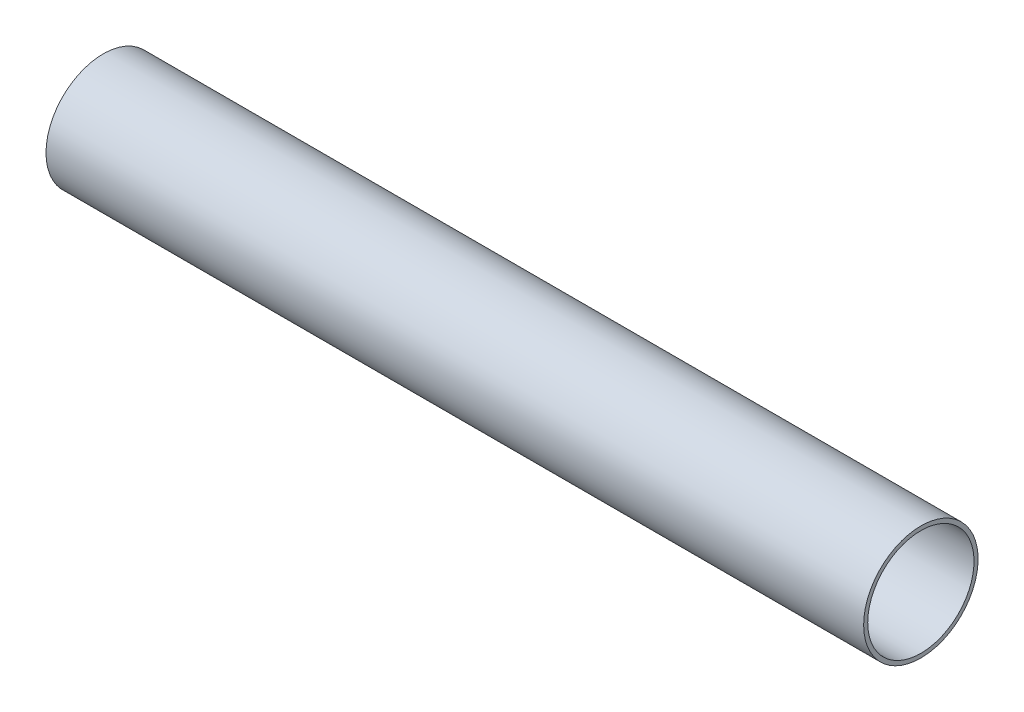
ISO-10303-21;
HEADER;
FILE_DESCRIPTION(('STEP AP214'),'2;1');
FILE_NAME('part.step','',(''),(''),'','','');
FILE_SCHEMA(('AUTOMOTIVE_DESIGN { 1 0 10303 214 1 1 1 1 }'));
ENDSEC;
DATA;
#1=APPLICATION_CONTEXT('core data for automotive mechanical design processes');
#2=APPLICATION_PROTOCOL_DEFINITION('international standard','automotive_design',2000,#1);
#3=PRODUCT_CONTEXT('',#1,'mechanical');
#4=PRODUCT('Part','Part','',(#3));
#5=PRODUCT_RELATED_PRODUCT_CATEGORY('part','',(#4));
#6=PRODUCT_DEFINITION_FORMATION('','',#4);
#7=PRODUCT_DEFINITION_CONTEXT('part definition',#1,'design');
#8=PRODUCT_DEFINITION('design','',#6,#7);
#9=PRODUCT_DEFINITION_SHAPE('','',#8);
#10=(LENGTH_UNIT() NAMED_UNIT(*) SI_UNIT(.MILLI.,.METRE.));
#11=(NAMED_UNIT(*) PLANE_ANGLE_UNIT() SI_UNIT($,.RADIAN.));
#12=(NAMED_UNIT(*) SI_UNIT($,.STERADIAN.) SOLID_ANGLE_UNIT());
#13=UNCERTAINTY_MEASURE_WITH_UNIT(LENGTH_MEASURE(1.E-05),#10,'distance_accuracy_value','');
#14=(GEOMETRIC_REPRESENTATION_CONTEXT(3) GLOBAL_UNCERTAINTY_ASSIGNED_CONTEXT((#13)) GLOBAL_UNIT_ASSIGNED_CONTEXT((#10,
#11,#12)) REPRESENTATION_CONTEXT('',''));
#15=CARTESIAN_POINT('',(0.,0.,0.));
#16=DIRECTION('',(0.,0.,1.));
#17=DIRECTION('',(1.,0.,0.));
#18=AXIS2_PLACEMENT_3D('',#15,#16,#17);
#19=CARTESIAN_POINT('',(0.,14.,0.));
#20=DIRECTION('',(1.,0.,0.));
#21=DIRECTION('',(0.,0.,-1.));
#22=AXIS2_PLACEMENT_3D('',#19,#20,#21);
#23=PLANE('',#22);
#24=CARTESIAN_POINT('',(0.,0.,0.));
#25=DIRECTION('',(-1.,0.,0.));
#26=DIRECTION('',(0.,0.,1.));
#27=AXIS2_PLACEMENT_3D('',#24,#25,#26);
#28=CIRCLE('',#27,13.);
#29=CARTESIAN_POINT('',(0.,0.,13.));
#30=VERTEX_POINT('',#29);
#31=EDGE_CURVE('E45',#30,#30,#28,.T.);
#32=ORIENTED_EDGE('',*,*,#31,.F.);
#33=EDGE_LOOP('',(#32));
#34=FACE_BOUND('',#33,.T.);
#35=CARTESIAN_POINT('',(0.,0.,0.));
#36=DIRECTION('',(-1.,0.,0.));
#37=DIRECTION('',(0.,0.,1.));
#38=AXIS2_PLACEMENT_3D('',#35,#36,#37);
#39=CIRCLE('',#38,14.);
#40=CARTESIAN_POINT('',(0.,0.,14.));
#41=VERTEX_POINT('',#40);
#42=EDGE_CURVE('E10',#41,#41,#39,.T.);
#43=ORIENTED_EDGE('',*,*,#42,.T.);
#44=EDGE_LOOP('',(#43));
#45=FACE_BOUND('',#44,.T.);
#46=ADVANCED_FACE('F31',(#34,#45),#23,.F.);
#47=CARTESIAN_POINT('',(0.,0.,0.));
#48=DIRECTION('',(-1.,0.,0.));
#49=DIRECTION('',(0.,0.,1.));
#50=AXIS2_PLACEMENT_3D('',#47,#48,#49);
#51=CYLINDRICAL_SURFACE('',#50,14.);
#52=CARTESIAN_POINT('',(200.,0.,0.));
#53=DIRECTION('',(-1.,0.,0.));
#54=DIRECTION('',(0.,0.,1.));
#55=AXIS2_PLACEMENT_3D('',#52,#53,#54);
#56=CIRCLE('',#55,14.);
#57=CARTESIAN_POINT('',(200.,0.,14.));
#58=VERTEX_POINT('',#57);
#59=EDGE_CURVE('E37',#58,#58,#56,.T.);
#60=ORIENTED_EDGE('',*,*,#59,.T.);
#61=EDGE_LOOP('',(#60));
#62=FACE_BOUND('',#61,.T.);
#63=ORIENTED_EDGE('',*,*,#42,.F.);
#64=EDGE_LOOP('',(#63));
#65=FACE_BOUND('',#64,.T.);
#66=ADVANCED_FACE('F55',(#62,#65),#51,.T.);
#67=CARTESIAN_POINT('',(200.,13.,0.));
#68=DIRECTION('',(-1.,0.,0.));
#69=DIRECTION('',(0.,0.,1.));
#70=AXIS2_PLACEMENT_3D('',#67,#68,#69);
#71=PLANE('',#70);
#72=ORIENTED_EDGE('',*,*,#59,.F.);
#73=EDGE_LOOP('',(#72));
#74=FACE_BOUND('',#73,.T.);
#75=CARTESIAN_POINT('',(200.,0.,0.));
#76=DIRECTION('',(-1.,0.,0.));
#77=DIRECTION('',(0.,0.,1.));
#78=AXIS2_PLACEMENT_3D('',#75,#76,#77);
#79=CIRCLE('',#78,13.);
#80=CARTESIAN_POINT('',(200.,0.,13.));
#81=VERTEX_POINT('',#80);
#82=EDGE_CURVE('E41',#81,#81,#79,.T.);
#83=ORIENTED_EDGE('',*,*,#82,.T.);
#84=EDGE_LOOP('',(#83));
#85=FACE_BOUND('',#84,.T.);
#86=ADVANCED_FACE('F59',(#74,#85),#71,.F.);
#87=CARTESIAN_POINT('',(0.,0.,0.));
#88=DIRECTION('',(-1.,0.,0.));
#89=DIRECTION('',(0.,0.,1.));
#90=AXIS2_PLACEMENT_3D('',#87,#88,#89);
#91=CYLINDRICAL_SURFACE('',#90,13.);
#92=ORIENTED_EDGE('',*,*,#31,.T.);
#93=EDGE_LOOP('',(#92));
#94=FACE_BOUND('',#93,.T.);
#95=ORIENTED_EDGE('',*,*,#82,.F.);
#96=EDGE_LOOP('',(#95));
#97=FACE_BOUND('',#96,.T.);
#98=ADVANCED_FACE('F51',(#94,#97),#91,.F.);
#99=CLOSED_SHELL('',(#46,#66,#86,#98));
#100=MANIFOLD_SOLID_BREP('B2',#99);
#101=ADVANCED_BREP_SHAPE_REPRESENTATION('',(#18,#100),#14);
#102=SHAPE_DEFINITION_REPRESENTATION(#9,#101);
ENDSEC;
END-ISO-10303-21;
